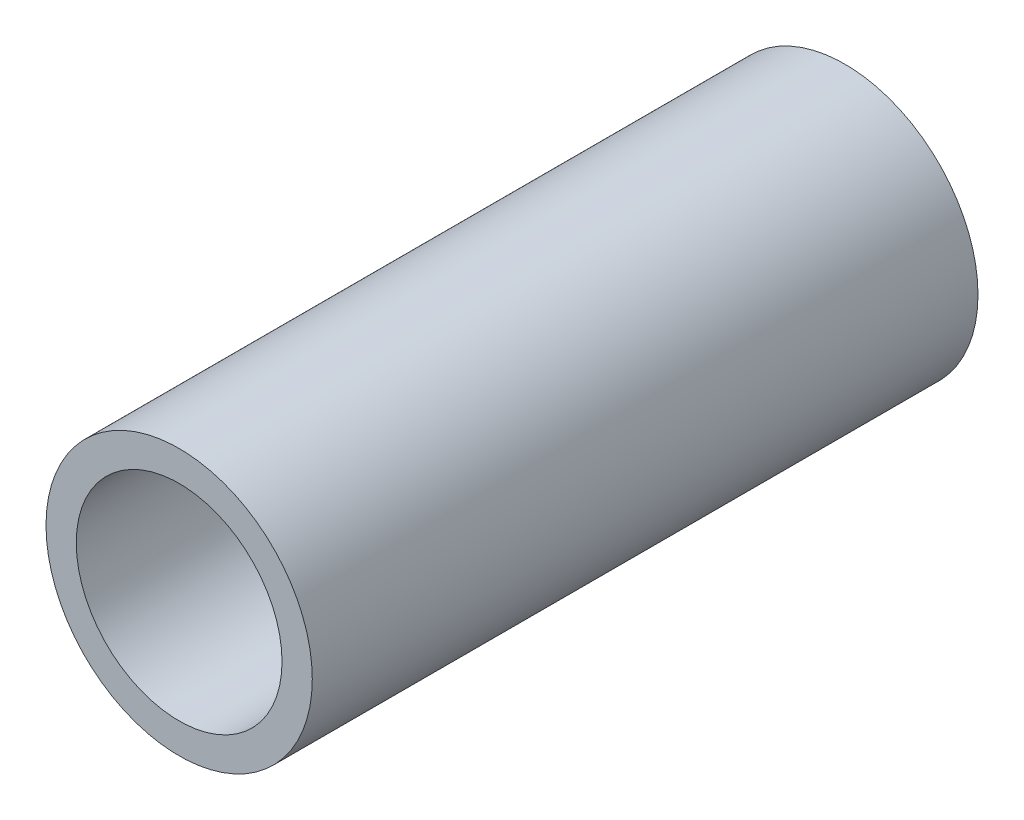
ISO-10303-21;
HEADER;
FILE_DESCRIPTION(('STEP AP214'),'2;1');
FILE_NAME('part.step','',(''),(''),'','','');
FILE_SCHEMA(('AUTOMOTIVE_DESIGN { 1 0 10303 214 1 1 1 1 }'));
ENDSEC;
DATA;
#1=APPLICATION_CONTEXT('core data for automotive mechanical design processes');
#2=APPLICATION_PROTOCOL_DEFINITION('international standard','automotive_design',2000,#1);
#3=PRODUCT_CONTEXT('',#1,'mechanical');
#4=PRODUCT('Part','Part','',(#3));
#5=PRODUCT_RELATED_PRODUCT_CATEGORY('part','',(#4));
#6=PRODUCT_DEFINITION_FORMATION('','',#4);
#7=PRODUCT_DEFINITION_CONTEXT('part definition',#1,'design');
#8=PRODUCT_DEFINITION('design','',#6,#7);
#9=PRODUCT_DEFINITION_SHAPE('','',#8);
#10=(LENGTH_UNIT() NAMED_UNIT(*) SI_UNIT(.MILLI.,.METRE.));
#11=(NAMED_UNIT(*) PLANE_ANGLE_UNIT() SI_UNIT($,.RADIAN.));
#12=(NAMED_UNIT(*) SI_UNIT($,.STERADIAN.) SOLID_ANGLE_UNIT());
#13=UNCERTAINTY_MEASURE_WITH_UNIT(LENGTH_MEASURE(1.E-05),#10,'distance_accuracy_value','');
#14=(GEOMETRIC_REPRESENTATION_CONTEXT(3) GLOBAL_UNCERTAINTY_ASSIGNED_CONTEXT((#13)) GLOBAL_UNIT_ASSIGNED_CONTEXT((#10,
#11,#12)) REPRESENTATION_CONTEXT('',''));
#15=CARTESIAN_POINT('',(0.,0.,0.));
#16=DIRECTION('',(0.,0.,1.));
#17=DIRECTION('',(1.,0.,0.));
#18=AXIS2_PLACEMENT_3D('',#15,#16,#17);
#19=CARTESIAN_POINT('',(0.,0.,11.));
#20=DIRECTION('',(0.,0.,1.));
#21=DIRECTION('',(1.,0.,0.));
#22=AXIS2_PLACEMENT_3D('',#19,#20,#21);
#23=PLANE('',#22);
#24=CARTESIAN_POINT('',(0.,0.,11.));
#25=DIRECTION('',(0.,0.,1.));
#26=DIRECTION('',(1.,0.,0.));
#27=AXIS2_PLACEMENT_3D('',#24,#25,#26);
#28=CIRCLE('',#27,2.2);
#29=CARTESIAN_POINT('',(2.2,0.,11.));
#30=VERTEX_POINT('',#29);
#31=EDGE_CURVE('E10',#30,#30,#28,.T.);
#32=ORIENTED_EDGE('',*,*,#31,.T.);
#33=EDGE_LOOP('',(#32));
#34=FACE_BOUND('',#33,.T.);
#35=CARTESIAN_POINT('',(0.,0.,11.));
#36=DIRECTION('',(0.,0.,1.));
#37=DIRECTION('',(1.,0.,0.));
#38=AXIS2_PLACEMENT_3D('',#35,#36,#37);
#39=CIRCLE('',#38,1.7);
#40=CARTESIAN_POINT('',(1.7,0.,11.));
#41=VERTEX_POINT('',#40);
#42=EDGE_CURVE('E46',#41,#41,#39,.T.);
#43=ORIENTED_EDGE('',*,*,#42,.F.);
#44=EDGE_LOOP('',(#43));
#45=FACE_BOUND('',#44,.T.);
#46=ADVANCED_FACE('F35',(#34,#45),#23,.T.);
#47=CARTESIAN_POINT('',(0.,0.,0.));
#48=DIRECTION('',(0.,0.,1.));
#49=DIRECTION('',(1.,0.,0.));
#50=AXIS2_PLACEMENT_3D('',#47,#48,#49);
#51=PLANE('',#50);
#52=CARTESIAN_POINT('',(0.,0.,0.));
#53=DIRECTION('',(0.,0.,1.));
#54=DIRECTION('',(1.,0.,0.));
#55=AXIS2_PLACEMENT_3D('',#52,#53,#54);
#56=CIRCLE('',#55,2.2);
#57=CARTESIAN_POINT('',(2.2,0.,0.));
#58=VERTEX_POINT('',#57);
#59=EDGE_CURVE('E39',#58,#58,#56,.T.);
#60=ORIENTED_EDGE('',*,*,#59,.F.);
#61=EDGE_LOOP('',(#60));
#62=FACE_BOUND('',#61,.T.);
#63=CARTESIAN_POINT('',(0.,0.,0.));
#64=DIRECTION('',(0.,0.,1.));
#65=DIRECTION('',(1.,0.,0.));
#66=AXIS2_PLACEMENT_3D('',#63,#64,#65);
#67=CIRCLE('',#66,1.7);
#68=CARTESIAN_POINT('',(1.7,0.,0.));
#69=VERTEX_POINT('',#68);
#70=EDGE_CURVE('E48',#69,#69,#67,.T.);
#71=ORIENTED_EDGE('',*,*,#70,.T.);
#72=EDGE_LOOP('',(#71));
#73=FACE_BOUND('',#72,.T.);
#74=ADVANCED_FACE('F58',(#62,#73),#51,.F.);
#75=CARTESIAN_POINT('',(0.,0.,11.));
#76=DIRECTION('',(0.,0.,-1.));
#77=DIRECTION('',(-1.,0.,0.));
#78=AXIS2_PLACEMENT_3D('',#75,#76,#77);
#79=CYLINDRICAL_SURFACE('',#78,2.2);
#80=ORIENTED_EDGE('',*,*,#31,.F.);
#81=EDGE_LOOP('',(#80));
#82=FACE_BOUND('',#81,.T.);
#83=ORIENTED_EDGE('',*,*,#59,.T.);
#84=EDGE_LOOP('',(#83));
#85=FACE_BOUND('',#84,.T.);
#86=ADVANCED_FACE('F37',(#82,#85),#79,.T.);
#87=CARTESIAN_POINT('',(0.,0.,11.));
#88=DIRECTION('',(0.,0.,-1.));
#89=DIRECTION('',(-1.,0.,0.));
#90=AXIS2_PLACEMENT_3D('',#87,#88,#89);
#91=CYLINDRICAL_SURFACE('',#90,1.7);
#92=ORIENTED_EDGE('',*,*,#42,.T.);
#93=EDGE_LOOP('',(#92));
#94=FACE_BOUND('',#93,.T.);
#95=ORIENTED_EDGE('',*,*,#70,.F.);
#96=EDGE_LOOP('',(#95));
#97=FACE_BOUND('',#96,.T.);
#98=ADVANCED_FACE('F54',(#94,#97),#91,.F.);
#99=CLOSED_SHELL('',(#46,#74,#86,#98));
#100=MANIFOLD_SOLID_BREP('B2',#99);
#101=ADVANCED_BREP_SHAPE_REPRESENTATION('',(#18,#100),#14);
#102=SHAPE_DEFINITION_REPRESENTATION(#9,#101);
ENDSEC;
END-ISO-10303-21;
